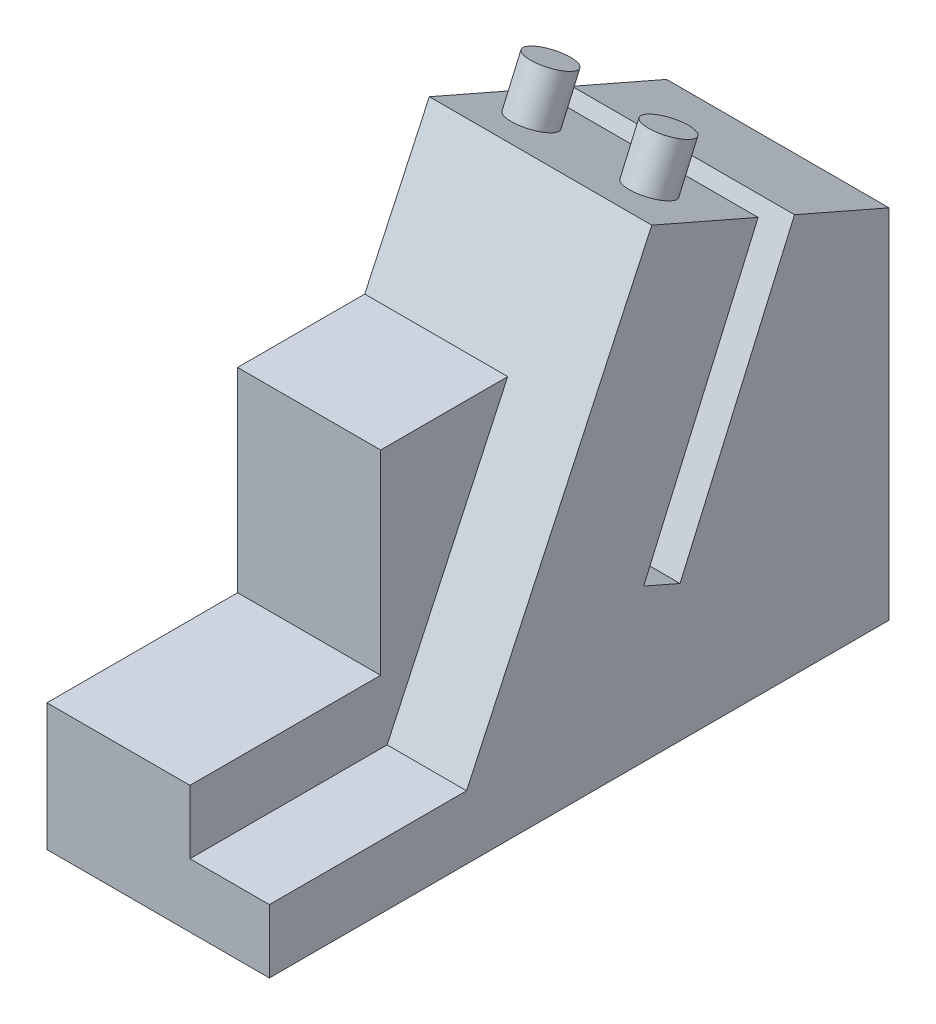
ISO-10303-21;
HEADER;
FILE_DESCRIPTION(('STEP AP214'),'2;1');
FILE_NAME('part.step','',(''),(''),'','','');
FILE_SCHEMA(('AUTOMOTIVE_DESIGN { 1 0 10303 214 1 1 1 1 }'));
ENDSEC;
DATA;
#1=APPLICATION_CONTEXT('core data for automotive mechanical design processes');
#2=APPLICATION_PROTOCOL_DEFINITION('international standard','automotive_design',2000,#1);
#3=PRODUCT_CONTEXT('',#1,'mechanical');
#4=PRODUCT('Part','Part','',(#3));
#5=PRODUCT_RELATED_PRODUCT_CATEGORY('part','',(#4));
#6=PRODUCT_DEFINITION_FORMATION('','',#4);
#7=PRODUCT_DEFINITION_CONTEXT('part definition',#1,'design');
#8=PRODUCT_DEFINITION('design','',#6,#7);
#9=PRODUCT_DEFINITION_SHAPE('','',#8);
#10=(LENGTH_UNIT() NAMED_UNIT(*) SI_UNIT(.MILLI.,.METRE.));
#11=(NAMED_UNIT(*) PLANE_ANGLE_UNIT() SI_UNIT($,.RADIAN.));
#12=(NAMED_UNIT(*) SI_UNIT($,.STERADIAN.) SOLID_ANGLE_UNIT());
#13=UNCERTAINTY_MEASURE_WITH_UNIT(LENGTH_MEASURE(1.E-05),#10,'distance_accuracy_value','');
#14=(GEOMETRIC_REPRESENTATION_CONTEXT(3) GLOBAL_UNCERTAINTY_ASSIGNED_CONTEXT((#13)) GLOBAL_UNIT_ASSIGNED_CONTEXT((#10,
#11,#12)) REPRESENTATION_CONTEXT('',''));
#15=CARTESIAN_POINT('',(0.,0.,0.));
#16=DIRECTION('',(0.,0.,1.));
#17=DIRECTION('',(1.,0.,0.));
#18=AXIS2_PLACEMENT_3D('',#15,#16,#17);
#19=CARTESIAN_POINT('',(14.,58.,-39.));
#20=DIRECTION('',(-1.,0.,0.));
#21=DIRECTION('',(0.,0.,1.));
#22=AXIS2_PLACEMENT_3D('',#19,#20,#21);
#23=PLANE('',#22);
#24=DIRECTION('',(0.,-1.,0.));
#25=VECTOR('',#24,1.);
#26=CARTESIAN_POINT('',(14.,58.,-39.));
#27=LINE('',#26,#25);
#28=CARTESIAN_POINT('',(14.,44.9559672603152,-39.));
#29=VERTEX_POINT('',#28);
#30=CARTESIAN_POINT('',(14.,0.,-39.));
#31=VERTEX_POINT('',#30);
#32=EDGE_CURVE('E195',#29,#31,#27,.T.);
#33=ORIENTED_EDGE('',*,*,#32,.F.);
#34=DIRECTION('',(0.,-0.400238277307216,-0.916411109370763));
#35=VECTOR('',#34,1.);
#36=CARTESIAN_POINT('',(14.,50.1533538741428,-27.0997318281217));
#37=LINE('',#36,#35);
#38=CARTESIAN_POINT('',(14.,50.1533538741428,-27.0997318281217));
#39=VERTEX_POINT('',#38);
#40=EDGE_CURVE('E315',#39,#29,#37,.T.);
#41=ORIENTED_EDGE('',*,*,#40,.F.);
#42=DIRECTION('',(0.,0.916411109370763,-0.400238277307216));
#43=VECTOR('',#42,1.);
#44=CARTESIAN_POINT('',(14.,17.1625539367953,-12.6911538450619));
#45=LINE('',#44,#43);
#46=CARTESIAN_POINT('',(14.,17.1625539367953,-12.6911538450619));
#47=VERTEX_POINT('',#46);
#48=EDGE_CURVE('E324',#47,#39,#45,.T.);
#49=ORIENTED_EDGE('',*,*,#48,.F.);
#50=DIRECTION('',(0.,-0.400238277307216,-0.916411109370763));
#51=VECTOR('',#50,1.);
#52=CARTESIAN_POINT('',(14.,19.1637453233314,-8.10909829820809));
#53=LINE('',#52,#51);
#54=CARTESIAN_POINT('',(14.,19.1637453233314,-8.10909829820809));
#55=VERTEX_POINT('',#54);
#56=EDGE_CURVE('E327',#55,#47,#53,.T.);
#57=ORIENTED_EDGE('',*,*,#56,.F.);
#58=DIRECTION('',(0.,-0.916411109370763,0.400238277307216));
#59=VECTOR('',#58,1.);
#60=CARTESIAN_POINT('',(14.,52.1545452606788,-22.5176762812679));
#61=LINE('',#60,#59);
#62=CARTESIAN_POINT('',(14.,52.1545452606788,-22.5176762812679));
#63=VERTEX_POINT('',#62);
#64=EDGE_CURVE('E161',#63,#55,#61,.T.);
#65=ORIENTED_EDGE('',*,*,#64,.F.);
#66=DIRECTION('',(0.,-0.400238277307216,-0.916411109370763));
#67=VECTOR('',#66,1.);
#68=CARTESIAN_POINT('',(14.,58.,-9.1335499591218));
#69=LINE('',#68,#67);
#70=CARTESIAN_POINT('',(14.,58.,-9.1335499591218));
#71=VERTEX_POINT('',#70);
#72=EDGE_CURVE('E146',#71,#63,#69,.T.);
#73=ORIENTED_EDGE('',*,*,#72,.F.);
#74=DIRECTION('',(0.,0.906307787036651,-0.422618261740697));
#75=VECTOR('',#74,1.);
#76=CARTESIAN_POINT('',(14.,8.,14.181832948628));
#77=LINE('',#76,#75);
#78=CARTESIAN_POINT('',(14.,8.,14.181832948628));
#79=VERTEX_POINT('',#78);
#80=EDGE_CURVE('E158',#79,#71,#77,.T.);
#81=ORIENTED_EDGE('',*,*,#80,.F.);
#82=DIRECTION('',(0.,0.,-1.));
#83=VECTOR('',#82,1.);
#84=CARTESIAN_POINT('',(14.,8.,39.));
#85=LINE('',#84,#83);
#86=CARTESIAN_POINT('',(14.,8.,39.));
#87=VERTEX_POINT('',#86);
#88=EDGE_CURVE('E167',#87,#79,#85,.T.);
#89=ORIENTED_EDGE('',*,*,#88,.F.);
#90=DIRECTION('',(0.,-1.,0.));
#91=VECTOR('',#90,1.);
#92=CARTESIAN_POINT('',(14.,58.,39.));
#93=LINE('',#92,#91);
#94=CARTESIAN_POINT('',(14.,0.,39.));
#95=VERTEX_POINT('',#94);
#96=EDGE_CURVE('E61',#87,#95,#93,.T.);
#97=ORIENTED_EDGE('',*,*,#96,.T.);
#98=DIRECTION('',(0.,0.,-1.));
#99=VECTOR('',#98,1.);
#100=CARTESIAN_POINT('',(14.,0.,-39.));
#101=LINE('',#100,#99);
#102=EDGE_CURVE('E153',#95,#31,#101,.T.);
#103=ORIENTED_EDGE('',*,*,#102,.T.);
#104=EDGE_LOOP('',(#33,#41,#49,#57,#65,#73,#81,#89,#97,#103));
#105=FACE_BOUND('',#104,.T.);
#106=ADVANCED_FACE('F39',(#105),#23,.F.);
#107=CARTESIAN_POINT('',(-14.,58.,-39.));
#108=DIRECTION('',(0.,0.,1.));
#109=DIRECTION('',(1.,0.,0.));
#110=AXIS2_PLACEMENT_3D('',#107,#108,#109);
#111=PLANE('',#110);
#112=DIRECTION('',(0.,-1.,0.));
#113=VECTOR('',#112,1.);
#114=CARTESIAN_POINT('',(-14.,58.,-39.));
#115=LINE('',#114,#113);
#116=CARTESIAN_POINT('',(-14.,44.9559672603152,-39.));
#117=VERTEX_POINT('',#116);
#118=CARTESIAN_POINT('',(-14.,0.,-39.));
#119=VERTEX_POINT('',#118);
#120=EDGE_CURVE('E193',#117,#119,#115,.T.);
#121=ORIENTED_EDGE('',*,*,#120,.F.);
#122=DIRECTION('',(1.,0.,0.));
#123=VECTOR('',#122,1.);
#124=CARTESIAN_POINT('',(-16.,44.9559672603152,-39.));
#125=LINE('',#124,#123);
#126=EDGE_CURVE('E309',#117,#29,#125,.T.);
#127=ORIENTED_EDGE('',*,*,#126,.T.);
#128=ORIENTED_EDGE('',*,*,#32,.T.);
#129=DIRECTION('',(-1.,0.,0.));
#130=VECTOR('',#129,1.);
#131=CARTESIAN_POINT('',(-14.,0.,-39.));
#132=LINE('',#131,#130);
#133=EDGE_CURVE('E182',#31,#119,#132,.T.);
#134=ORIENTED_EDGE('',*,*,#133,.T.);
#135=EDGE_LOOP('',(#121,#127,#128,#134));
#136=FACE_BOUND('',#135,.T.);
#137=ADVANCED_FACE('F230',(#136),#111,.F.);
#138=CARTESIAN_POINT('',(-14.,58.,-39.));
#139=DIRECTION('',(1.,0.,0.));
#140=DIRECTION('',(0.,0.,-1.));
#141=AXIS2_PLACEMENT_3D('',#138,#139,#140);
#142=PLANE('',#141);
#143=DIRECTION('',(0.,0.916411109370763,-0.400238277307216));
#144=VECTOR('',#143,1.);
#145=CARTESIAN_POINT('',(-14.,61.1078541572919,-31.8840587281955));
#146=LINE('',#145,#144);
#147=CARTESIAN_POINT('',(-14.,17.1625539367953,-12.6911538450619));
#148=VERTEX_POINT('',#147);
#149=CARTESIAN_POINT('',(-14.,50.1533538741428,-27.0997318281217));
#150=VERTEX_POINT('',#149);
#151=EDGE_CURVE('E203',#148,#150,#146,.T.);
#152=ORIENTED_EDGE('',*,*,#151,.T.);
#153=DIRECTION('',(0.,-0.400238277307216,-0.916411109370763));
#154=VECTOR('',#153,1.);
#155=CARTESIAN_POINT('',(-14.,47.0454997168509,-34.2156730999262));
#156=LINE('',#155,#154);
#157=EDGE_CURVE('E206',#150,#117,#156,.T.);
#158=ORIENTED_EDGE('',*,*,#157,.T.);
#159=ORIENTED_EDGE('',*,*,#120,.T.);
#160=DIRECTION('',(0.,0.,1.));
#161=VECTOR('',#160,1.);
#162=CARTESIAN_POINT('',(-14.,0.,-39.));
#163=LINE('',#162,#161);
#164=CARTESIAN_POINT('',(-14.,0.,39.));
#165=VERTEX_POINT('',#164);
#166=EDGE_CURVE('E185',#119,#165,#163,.T.);
#167=ORIENTED_EDGE('',*,*,#166,.T.);
#168=DIRECTION('',(0.,-1.,0.));
#169=VECTOR('',#168,1.);
#170=CARTESIAN_POINT('',(-14.,58.,39.));
#171=LINE('',#170,#169);
#172=CARTESIAN_POINT('',(-14.,16.,39.));
#173=VERTEX_POINT('',#172);
#174=EDGE_CURVE('E191',#173,#165,#171,.T.);
#175=ORIENTED_EDGE('',*,*,#174,.F.);
#176=DIRECTION('',(0.,0.,-1.));
#177=VECTOR('',#176,1.);
#178=CARTESIAN_POINT('',(-14.,16.,-39.));
#179=LINE('',#178,#177);
#180=CARTESIAN_POINT('',(-14.,16.,15.));
#181=VERTEX_POINT('',#180);
#182=EDGE_CURVE('E296',#173,#181,#179,.T.);
#183=ORIENTED_EDGE('',*,*,#182,.T.);
#184=DIRECTION('',(0.,1.,0.));
#185=VECTOR('',#184,1.);
#186=CARTESIAN_POINT('',(-14.,58.,15.));
#187=LINE('',#186,#185);
#188=CARTESIAN_POINT('',(-14.,40.5575458243529,15.));
#189=VERTEX_POINT('',#188);
#190=EDGE_CURVE('E301',#181,#189,#187,.T.);
#191=ORIENTED_EDGE('',*,*,#190,.T.);
#192=DIRECTION('',(0.,0.,-1.));
#193=VECTOR('',#192,1.);
#194=CARTESIAN_POINT('',(-14.,40.5575458243529,-39.));
#195=LINE('',#194,#193);
#196=CARTESIAN_POINT('',(-14.,40.5575458243529,-0.999999999999992));
#197=VERTEX_POINT('',#196);
#198=EDGE_CURVE('E172',#189,#197,#195,.T.);
#199=ORIENTED_EDGE('',*,*,#198,.T.);
#200=DIRECTION('',(0.,0.906307787036651,-0.422618261740697));
#201=VECTOR('',#200,1.);
#202=CARTESIAN_POINT('',(-14.,69.4395140447526,-14.4678829637616));
#203=LINE('',#202,#201);
#204=CARTESIAN_POINT('',(-14.,58.,-9.1335499591218));
#205=VERTEX_POINT('',#204);
#206=EDGE_CURVE('E168',#197,#205,#203,.T.);
#207=ORIENTED_EDGE('',*,*,#206,.T.);
#208=DIRECTION('',(0.,-0.400238277307216,-0.916411109370763));
#209=VECTOR('',#208,1.);
#210=CARTESIAN_POINT('',(-14.,47.0454997168509,-34.2156730999262));
#211=LINE('',#210,#209);
#212=CARTESIAN_POINT('',(-14.,52.1545452606788,-22.5176762812679));
#213=VERTEX_POINT('',#212);
#214=EDGE_CURVE('E149',#205,#213,#211,.T.);
#215=ORIENTED_EDGE('',*,*,#214,.T.);
#216=DIRECTION('',(0.,-0.916411109370763,0.400238277307216));
#217=VECTOR('',#216,1.);
#218=CARTESIAN_POINT('',(-14.,63.1090455438279,-27.3020031813417));
#219=LINE('',#218,#217);
#220=CARTESIAN_POINT('',(-14.,19.1637453233314,-8.10909829820809));
#221=VERTEX_POINT('',#220);
#222=EDGE_CURVE('E197',#213,#221,#219,.T.);
#223=ORIENTED_EDGE('',*,*,#222,.T.);
#224=DIRECTION('',(0.,-0.400238277307216,-0.916411109370763));
#225=VECTOR('',#224,1.);
#226=CARTESIAN_POINT('',(-14.,14.0546997795034,-19.8070951168664));
#227=LINE('',#226,#225);
#228=EDGE_CURVE('E200',#221,#148,#227,.T.);
#229=ORIENTED_EDGE('',*,*,#228,.T.);
#230=EDGE_LOOP('',(#152,#158,#159,#167,#175,#183,#191,#199,#207,#215,#223,#229));
#231=FACE_BOUND('',#230,.T.);
#232=ADVANCED_FACE('F235',(#231),#142,.F.);
#233=CARTESIAN_POINT('',(-14.,58.,39.));
#234=DIRECTION('',(0.,0.,-1.));
#235=DIRECTION('',(-1.,0.,0.));
#236=AXIS2_PLACEMENT_3D('',#233,#234,#235);
#237=PLANE('',#236);
#238=DIRECTION('',(0.,1.,0.));
#239=VECTOR('',#238,1.);
#240=CARTESIAN_POINT('',(4.00000000000001,8.,39.));
#241=LINE('',#240,#239);
#242=CARTESIAN_POINT('',(4.00000000000001,8.,39.));
#243=VERTEX_POINT('',#242);
#244=CARTESIAN_POINT('',(4.00000000000001,16.,39.));
#245=VERTEX_POINT('',#244);
#246=EDGE_CURVE('E175',#243,#245,#241,.T.);
#247=ORIENTED_EDGE('',*,*,#246,.T.);
#248=DIRECTION('',(1.,0.,0.));
#249=VECTOR('',#248,1.);
#250=CARTESIAN_POINT('',(-16.,16.,39.));
#251=LINE('',#250,#249);
#252=EDGE_CURVE('E53',#173,#245,#251,.T.);
#253=ORIENTED_EDGE('',*,*,#252,.F.);
#254=ORIENTED_EDGE('',*,*,#174,.T.);
#255=DIRECTION('',(1.,0.,0.));
#256=VECTOR('',#255,1.);
#257=CARTESIAN_POINT('',(-14.,0.,39.));
#258=LINE('',#257,#256);
#259=EDGE_CURVE('E188',#165,#95,#258,.T.);
#260=ORIENTED_EDGE('',*,*,#259,.T.);
#261=ORIENTED_EDGE('',*,*,#96,.F.);
#262=DIRECTION('',(1.,0.,0.));
#263=VECTOR('',#262,1.);
#264=CARTESIAN_POINT('',(4.00000000000001,8.,39.));
#265=LINE('',#264,#263);
#266=EDGE_CURVE('E178',#243,#87,#265,.T.);
#267=ORIENTED_EDGE('',*,*,#266,.F.);
#268=EDGE_LOOP('',(#247,#253,#254,#260,#261,#267));
#269=FACE_BOUND('',#268,.T.);
#270=ADVANCED_FACE('F240',(#269),#237,.F.);
#271=CARTESIAN_POINT('',(0.,0.,0.));
#272=DIRECTION('',(0.,1.,0.));
#273=DIRECTION('',(0.,0.,1.));
#274=AXIS2_PLACEMENT_3D('',#271,#272,#273);
#275=PLANE('',#274);
#276=ORIENTED_EDGE('',*,*,#102,.F.);
#277=ORIENTED_EDGE('',*,*,#259,.F.);
#278=ORIENTED_EDGE('',*,*,#166,.F.);
#279=ORIENTED_EDGE('',*,*,#133,.F.);
#280=EDGE_LOOP('',(#276,#277,#278,#279));
#281=FACE_BOUND('',#280,.T.);
#282=ADVANCED_FACE('F247',(#281),#275,.F.);
#283=CARTESIAN_POINT('',(4.,8.,14.181832948628));
#284=DIRECTION('',(0.,-0.422618261740697,-0.906307787036651));
#285=DIRECTION('',(0.,0.906307787036651,-0.422618261740697));
#286=AXIS2_PLACEMENT_3D('',#283,#284,#285);
#287=PLANE('',#286);
#288=ORIENTED_EDGE('',*,*,#80,.T.);
#289=DIRECTION('',(1.,0.,0.));
#290=VECTOR('',#289,1.);
#291=CARTESIAN_POINT('',(4.,58.,-9.1335499591218));
#292=LINE('',#291,#290);
#293=EDGE_CURVE('E142',#205,#71,#292,.T.);
#294=ORIENTED_EDGE('',*,*,#293,.F.);
#295=ORIENTED_EDGE('',*,*,#206,.F.);
#296=DIRECTION('',(1.,0.,0.));
#297=VECTOR('',#296,1.);
#298=CARTESIAN_POINT('',(-16.,40.5575458243529,-0.999999999999992));
#299=LINE('',#298,#297);
#300=CARTESIAN_POINT('',(4.,40.5575458243529,-0.999999999999995));
#301=VERTEX_POINT('',#300);
#302=EDGE_CURVE('E283',#197,#301,#299,.T.);
#303=ORIENTED_EDGE('',*,*,#302,.T.);
#304=DIRECTION('',(0.,0.906307787036651,-0.422618261740697));
#305=VECTOR('',#304,1.);
#306=CARTESIAN_POINT('',(4.,8.,14.181832948628));
#307=LINE('',#306,#305);
#308=CARTESIAN_POINT('',(4.,8.,14.181832948628));
#309=VERTEX_POINT('',#308);
#310=EDGE_CURVE('E170',#309,#301,#307,.T.);
#311=ORIENTED_EDGE('',*,*,#310,.F.);
#312=DIRECTION('',(1.,0.,0.));
#313=VECTOR('',#312,1.);
#314=CARTESIAN_POINT('',(4.,8.,14.181832948628));
#315=LINE('',#314,#313);
#316=EDGE_CURVE('E154',#309,#79,#315,.T.);
#317=ORIENTED_EDGE('',*,*,#316,.T.);
#318=EDGE_LOOP('',(#288,#294,#295,#303,#311,#317));
#319=FACE_BOUND('',#318,.T.);
#320=ADVANCED_FACE('F164',(#319),#287,.F.);
#321=CARTESIAN_POINT('',(4.00000000000001,8.,39.));
#322=DIRECTION('',(0.,-1.,0.));
#323=DIRECTION('',(0.,0.,-1.));
#324=AXIS2_PLACEMENT_3D('',#321,#322,#323);
#325=PLANE('',#324);
#326=ORIENTED_EDGE('',*,*,#88,.T.);
#327=ORIENTED_EDGE('',*,*,#316,.F.);
#328=DIRECTION('',(0.,0.,-1.));
#329=VECTOR('',#328,1.);
#330=CARTESIAN_POINT('',(4.00000000000001,8.,39.));
#331=LINE('',#330,#329);
#332=EDGE_CURVE('E304',#243,#309,#331,.T.);
#333=ORIENTED_EDGE('',*,*,#332,.F.);
#334=ORIENTED_EDGE('',*,*,#266,.T.);
#335=EDGE_LOOP('',(#326,#327,#333,#334));
#336=FACE_BOUND('',#335,.T.);
#337=ADVANCED_FACE('F254',(#336),#325,.F.);
#338=CARTESIAN_POINT('',(4.,0.,0.));
#339=DIRECTION('',(1.,0.,0.));
#340=DIRECTION('',(0.,0.,-1.));
#341=AXIS2_PLACEMENT_3D('',#338,#339,#340);
#342=PLANE('',#341);
#343=DIRECTION('',(0.,0.,-1.));
#344=VECTOR('',#343,1.);
#345=CARTESIAN_POINT('',(4.,40.5575458243529,15.));
#346=LINE('',#345,#344);
#347=CARTESIAN_POINT('',(4.,40.5575458243529,15.));
#348=VERTEX_POINT('',#347);
#349=EDGE_CURVE('E279',#348,#301,#346,.T.);
#350=ORIENTED_EDGE('',*,*,#349,.F.);
#351=DIRECTION('',(0.,1.,0.));
#352=VECTOR('',#351,1.);
#353=CARTESIAN_POINT('',(4.,16.,15.));
#354=LINE('',#353,#352);
#355=CARTESIAN_POINT('',(4.,16.,15.));
#356=VERTEX_POINT('',#355);
#357=EDGE_CURVE('E287',#356,#348,#354,.T.);
#358=ORIENTED_EDGE('',*,*,#357,.F.);
#359=DIRECTION('',(0.,0.,-1.));
#360=VECTOR('',#359,1.);
#361=CARTESIAN_POINT('',(4.00000000000001,16.,39.));
#362=LINE('',#361,#360);
#363=EDGE_CURVE('E289',#245,#356,#362,.T.);
#364=ORIENTED_EDGE('',*,*,#363,.F.);
#365=ORIENTED_EDGE('',*,*,#246,.F.);
#366=ORIENTED_EDGE('',*,*,#332,.T.);
#367=ORIENTED_EDGE('',*,*,#310,.T.);
#368=EDGE_LOOP('',(#350,#358,#364,#365,#366,#367));
#369=FACE_BOUND('',#368,.T.);
#370=ADVANCED_FACE('F257',(#369),#342,.T.);
#371=CARTESIAN_POINT('',(-16.,40.5575458243529,15.));
#372=DIRECTION('',(0.,-1.,0.));
#373=DIRECTION('',(0.,0.,-1.));
#374=AXIS2_PLACEMENT_3D('',#371,#372,#373);
#375=PLANE('',#374);
#376=DIRECTION('',(1.,0.,0.));
#377=VECTOR('',#376,1.);
#378=CARTESIAN_POINT('',(-16.,40.5575458243529,15.));
#379=LINE('',#378,#377);
#380=EDGE_CURVE('E275',#189,#348,#379,.T.);
#381=ORIENTED_EDGE('',*,*,#380,.T.);
#382=ORIENTED_EDGE('',*,*,#349,.T.);
#383=ORIENTED_EDGE('',*,*,#302,.F.);
#384=ORIENTED_EDGE('',*,*,#198,.F.);
#385=EDGE_LOOP('',(#381,#382,#383,#384));
#386=FACE_BOUND('',#385,.T.);
#387=ADVANCED_FACE('F261',(#386),#375,.F.);
#388=CARTESIAN_POINT('',(-16.,16.,15.));
#389=DIRECTION('',(0.,0.,-1.));
#390=DIRECTION('',(-1.,0.,0.));
#391=AXIS2_PLACEMENT_3D('',#388,#389,#390);
#392=PLANE('',#391);
#393=DIRECTION('',(1.,0.,0.));
#394=VECTOR('',#393,1.);
#395=CARTESIAN_POINT('',(-16.,16.,15.));
#396=LINE('',#395,#394);
#397=EDGE_CURVE('E284',#181,#356,#396,.T.);
#398=ORIENTED_EDGE('',*,*,#397,.T.);
#399=ORIENTED_EDGE('',*,*,#357,.T.);
#400=ORIENTED_EDGE('',*,*,#380,.F.);
#401=ORIENTED_EDGE('',*,*,#190,.F.);
#402=EDGE_LOOP('',(#398,#399,#400,#401));
#403=FACE_BOUND('',#402,.T.);
#404=ADVANCED_FACE('F266',(#403),#392,.F.);
#405=CARTESIAN_POINT('',(-16.,16.,39.));
#406=DIRECTION('',(0.,-1.,0.));
#407=DIRECTION('',(0.,0.,-1.));
#408=AXIS2_PLACEMENT_3D('',#405,#406,#407);
#409=PLANE('',#408);
#410=ORIENTED_EDGE('',*,*,#252,.T.);
#411=ORIENTED_EDGE('',*,*,#363,.T.);
#412=ORIENTED_EDGE('',*,*,#397,.F.);
#413=ORIENTED_EDGE('',*,*,#182,.F.);
#414=EDGE_LOOP('',(#410,#411,#412,#413));
#415=FACE_BOUND('',#414,.T.);
#416=ADVANCED_FACE('F263',(#415),#409,.F.);
#417=CARTESIAN_POINT('',(-16.,50.1533538741428,-27.0997318281217));
#418=DIRECTION('',(0.,-0.916411109370763,0.400238277307216));
#419=DIRECTION('',(0.,-0.400238277307216,-0.916411109370763));
#420=AXIS2_PLACEMENT_3D('',#417,#418,#419);
#421=PLANE('',#420);
#422=DIRECTION('',(1.,0.,0.));
#423=VECTOR('',#422,1.);
#424=CARTESIAN_POINT('',(-16.,50.1533538741428,-27.0997318281217));
#425=LINE('',#424,#423);
#426=EDGE_CURVE('E319',#150,#39,#425,.T.);
#427=ORIENTED_EDGE('',*,*,#426,.T.);
#428=ORIENTED_EDGE('',*,*,#40,.T.);
#429=ORIENTED_EDGE('',*,*,#126,.F.);
#430=ORIENTED_EDGE('',*,*,#157,.F.);
#431=EDGE_LOOP('',(#427,#428,#429,#430));
#432=FACE_BOUND('',#431,.T.);
#433=ADVANCED_FACE('F265',(#432),#421,.F.);
#434=CARTESIAN_POINT('',(-16.,17.1625539367953,-12.6911538450619));
#435=DIRECTION('',(0.,-0.400238277307216,-0.916411109370763));
#436=DIRECTION('',(0.,0.916411109370763,-0.400238277307216));
#437=AXIS2_PLACEMENT_3D('',#434,#435,#436);
#438=PLANE('',#437);
#439=DIRECTION('',(1.,0.,0.));
#440=VECTOR('',#439,1.);
#441=CARTESIAN_POINT('',(-16.,17.1625539367953,-12.6911538450619));
#442=LINE('',#441,#440);
#443=EDGE_CURVE('E317',#148,#47,#442,.T.);
#444=ORIENTED_EDGE('',*,*,#443,.T.);
#445=ORIENTED_EDGE('',*,*,#48,.T.);
#446=ORIENTED_EDGE('',*,*,#426,.F.);
#447=ORIENTED_EDGE('',*,*,#151,.F.);
#448=EDGE_LOOP('',(#444,#445,#446,#447));
#449=FACE_BOUND('',#448,.T.);
#450=ADVANCED_FACE('F353',(#449),#438,.F.);
#451=CARTESIAN_POINT('',(-16.,19.1637453233314,-8.10909829820809));
#452=DIRECTION('',(0.,-0.916411109370763,0.400238277307216));
#453=DIRECTION('',(0.,-0.400238277307216,-0.916411109370763));
#454=AXIS2_PLACEMENT_3D('',#451,#452,#453);
#455=PLANE('',#454);
#456=DIRECTION('',(1.,0.,0.));
#457=VECTOR('',#456,1.);
#458=CARTESIAN_POINT('',(-16.,19.1637453233314,-8.10909829820809));
#459=LINE('',#458,#457);
#460=EDGE_CURVE('E314',#221,#55,#459,.T.);
#461=ORIENTED_EDGE('',*,*,#460,.T.);
#462=ORIENTED_EDGE('',*,*,#56,.T.);
#463=ORIENTED_EDGE('',*,*,#443,.F.);
#464=ORIENTED_EDGE('',*,*,#228,.F.);
#465=EDGE_LOOP('',(#461,#462,#463,#464));
#466=FACE_BOUND('',#465,.T.);
#467=ADVANCED_FACE('F224',(#466),#455,.F.);
#468=CARTESIAN_POINT('',(-16.,52.1545452606788,-22.5176762812679));
#469=DIRECTION('',(0.,0.400238277307216,0.916411109370763));
#470=DIRECTION('',(0.,-0.916411109370763,0.400238277307216));
#471=AXIS2_PLACEMENT_3D('',#468,#469,#470);
#472=PLANE('',#471);
#473=DIRECTION('',(1.,0.,0.));
#474=VECTOR('',#473,1.);
#475=CARTESIAN_POINT('',(-16.,52.1545452606788,-22.5176762812679));
#476=LINE('',#475,#474);
#477=EDGE_CURVE('E312',#213,#63,#476,.T.);
#478=ORIENTED_EDGE('',*,*,#477,.T.);
#479=ORIENTED_EDGE('',*,*,#64,.T.);
#480=ORIENTED_EDGE('',*,*,#460,.F.);
#481=ORIENTED_EDGE('',*,*,#222,.F.);
#482=EDGE_LOOP('',(#478,#479,#480,#481));
#483=FACE_BOUND('',#482,.T.);
#484=ADVANCED_FACE('F214',(#483),#472,.F.);
#485=CARTESIAN_POINT('',(-16.,58.,-9.1335499591218));
#486=DIRECTION('',(0.,-0.916411109370763,0.400238277307216));
#487=DIRECTION('',(0.,-0.400238277307216,-0.916411109370763));
#488=AXIS2_PLACEMENT_3D('',#485,#486,#487);
#489=PLANE('',#488);
#490=CARTESIAN_POINT('',(-8.02101576667269,54.9982129201959,-16.0066332794025));
#491=DIRECTION('',(0.,-0.916411109370763,0.400238277307216));
#492=DIRECTION('',(0.,-0.400238277307216,-0.916411109370763));
#493=AXIS2_PLACEMENT_3D('',#490,#491,#492);
#494=CIRCLE('',#493,2.75);
#495=CARTESIAN_POINT('',(-8.02101576667269,53.897557657601,-18.5267638301721));
#496=VERTEX_POINT('',#495);
#497=EDGE_CURVE('E11',#496,#496,#494,.F.);
#498=ORIENTED_EDGE('',*,*,#497,.F.);
#499=EDGE_LOOP('',(#498));
#500=FACE_BOUND('',#499,.T.);
#501=CARTESIAN_POINT('',(6.81844105565687,54.9982129201959,-16.0066332794025));
#502=DIRECTION('',(0.,-0.916411109370763,0.400238277307216));
#503=DIRECTION('',(0.,-0.400238277307216,-0.916411109370763));
#504=AXIS2_PLACEMENT_3D('',#501,#502,#503);
#505=CIRCLE('',#504,2.75);
#506=CARTESIAN_POINT('',(6.81844105565687,53.897557657601,-18.5267638301721));
#507=VERTEX_POINT('',#506);
#508=EDGE_CURVE('E46',#507,#507,#505,.F.);
#509=ORIENTED_EDGE('',*,*,#508,.F.);
#510=EDGE_LOOP('',(#509));
#511=FACE_BOUND('',#510,.T.);
#512=ORIENTED_EDGE('',*,*,#293,.T.);
#513=ORIENTED_EDGE('',*,*,#72,.T.);
#514=ORIENTED_EDGE('',*,*,#477,.F.);
#515=ORIENTED_EDGE('',*,*,#214,.F.);
#516=EDGE_LOOP('',(#512,#513,#514,#515));
#517=FACE_BOUND('',#516,.T.);
#518=ADVANCED_FACE('F144',(#500,#511,#517),#489,.F.);
#519=CARTESIAN_POINT('',(6.81844105565687,60.4966795764205,-18.4080629432458));
#520=DIRECTION('',(0.,-0.916411109370763,0.400238277307216));
#521=DIRECTION('',(0.,-0.400238277307216,-0.916411109370763));
#522=AXIS2_PLACEMENT_3D('',#519,#520,#521);
#523=CYLINDRICAL_SURFACE('',#522,2.75);
#524=CARTESIAN_POINT('',(6.81844105565687,60.4966795764205,-18.4080629432458));
#525=DIRECTION('',(0.,0.916411109370763,-0.400238277307216));
#526=DIRECTION('',(0.,0.400238277307216,0.916411109370763));
#527=AXIS2_PLACEMENT_3D('',#524,#525,#526);
#528=CIRCLE('',#527,2.75);
#529=CARTESIAN_POINT('',(6.81844105565687,61.5973348390153,-15.8879323924762));
#530=VERTEX_POINT('',#529);
#531=EDGE_CURVE('E331',#530,#530,#528,.T.);
#532=ORIENTED_EDGE('',*,*,#531,.F.);
#533=EDGE_LOOP('',(#532));
#534=FACE_BOUND('',#533,.T.);
#535=ORIENTED_EDGE('',*,*,#508,.T.);
#536=EDGE_LOOP('',(#535));
#537=FACE_BOUND('',#536,.T.);
#538=ADVANCED_FACE('F211',(#534,#537),#523,.T.);
#539=CARTESIAN_POINT('',(6.81844105565687,60.4966795764205,-18.4080629432458));
#540=DIRECTION('',(0.,0.916411109370763,-0.400238277307216));
#541=DIRECTION('',(0.,0.400238277307216,0.916411109370763));
#542=AXIS2_PLACEMENT_3D('',#539,#540,#541);
#543=PLANE('',#542);
#544=ORIENTED_EDGE('',*,*,#531,.T.);
#545=EDGE_LOOP('',(#544));
#546=FACE_BOUND('',#545,.T.);
#547=ADVANCED_FACE('F221',(#546),#543,.T.);
#548=CARTESIAN_POINT('',(-8.02101576667269,60.4966795764205,-18.4080629432458));
#549=DIRECTION('',(0.,-0.916411109370763,0.400238277307216));
#550=DIRECTION('',(0.,-0.400238277307216,-0.916411109370763));
#551=AXIS2_PLACEMENT_3D('',#548,#549,#550);
#552=CYLINDRICAL_SURFACE('',#551,2.75);
#553=CARTESIAN_POINT('',(-8.02101576667269,60.4966795764205,-18.4080629432458));
#554=DIRECTION('',(0.,0.916411109370763,-0.400238277307216));
#555=DIRECTION('',(0.,0.400238277307216,0.916411109370763));
#556=AXIS2_PLACEMENT_3D('',#553,#554,#555);
#557=CIRCLE('',#556,2.75);
#558=CARTESIAN_POINT('',(-8.02101576667269,61.5973348390153,-15.8879323924762));
#559=VERTEX_POINT('',#558);
#560=EDGE_CURVE('E162',#559,#559,#557,.T.);
#561=ORIENTED_EDGE('',*,*,#560,.F.);
#562=EDGE_LOOP('',(#561));
#563=FACE_BOUND('',#562,.T.);
#564=ORIENTED_EDGE('',*,*,#497,.T.);
#565=EDGE_LOOP('',(#564));
#566=FACE_BOUND('',#565,.T.);
#567=ADVANCED_FACE('F339',(#563,#566),#552,.T.);
#568=CARTESIAN_POINT('',(-8.02101576667269,60.4966795764205,-18.4080629432458));
#569=DIRECTION('',(0.,0.916411109370763,-0.400238277307216));
#570=DIRECTION('',(0.,0.400238277307216,0.916411109370763));
#571=AXIS2_PLACEMENT_3D('',#568,#569,#570);
#572=PLANE('',#571);
#573=ORIENTED_EDGE('',*,*,#560,.T.);
#574=EDGE_LOOP('',(#573));
#575=FACE_BOUND('',#574,.T.);
#576=ADVANCED_FACE('F337',(#575),#572,.T.);
#577=CLOSED_SHELL('',(#106,#137,#232,#270,#282,#320,#337,#370,#387,#404,#416,#433,#450,#467,
#484,#518,#538,#547,#567,#576));
#578=MANIFOLD_SOLID_BREP('B2',#577);
#579=ADVANCED_BREP_SHAPE_REPRESENTATION('',(#18,#578),#14);
#580=SHAPE_DEFINITION_REPRESENTATION(#9,#579);
ENDSEC;
END-ISO-10303-21;
